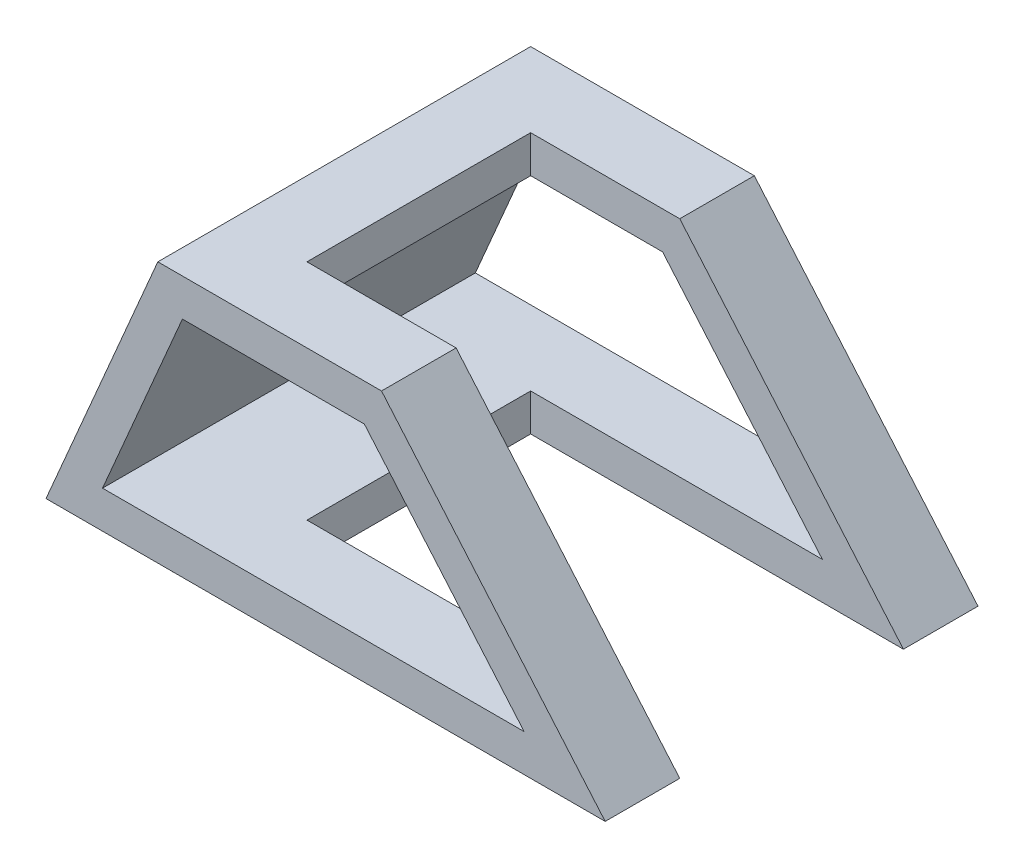
ISO-10303-21;
HEADER;
FILE_DESCRIPTION(('STEP AP214'),'2;1');
FILE_NAME('part.step','',(''),(''),'','','');
FILE_SCHEMA(('AUTOMOTIVE_DESIGN { 1 0 10303 214 1 1 1 1 }'));
ENDSEC;
DATA;
#1=APPLICATION_CONTEXT('core data for automotive mechanical design processes');
#2=APPLICATION_PROTOCOL_DEFINITION('international standard','automotive_design',2000,#1);
#3=PRODUCT_CONTEXT('',#1,'mechanical');
#4=PRODUCT('Part','Part','',(#3));
#5=PRODUCT_RELATED_PRODUCT_CATEGORY('part','',(#4));
#6=PRODUCT_DEFINITION_FORMATION('','',#4);
#7=PRODUCT_DEFINITION_CONTEXT('part definition',#1,'design');
#8=PRODUCT_DEFINITION('design','',#6,#7);
#9=PRODUCT_DEFINITION_SHAPE('','',#8);
#10=(LENGTH_UNIT() NAMED_UNIT(*) SI_UNIT(.MILLI.,.METRE.));
#11=(NAMED_UNIT(*) PLANE_ANGLE_UNIT() SI_UNIT($,.RADIAN.));
#12=(NAMED_UNIT(*) SI_UNIT($,.STERADIAN.) SOLID_ANGLE_UNIT());
#13=UNCERTAINTY_MEASURE_WITH_UNIT(LENGTH_MEASURE(1.E-05),#10,'distance_accuracy_value','');
#14=(GEOMETRIC_REPRESENTATION_CONTEXT(3) GLOBAL_UNCERTAINTY_ASSIGNED_CONTEXT((#13)) GLOBAL_UNIT_ASSIGNED_CONTEXT((#10,
#11,#12)) REPRESENTATION_CONTEXT('',''));
#15=CARTESIAN_POINT('',(0.,0.,0.));
#16=DIRECTION('',(0.,0.,1.));
#17=DIRECTION('',(1.,0.,0.));
#18=AXIS2_PLACEMENT_3D('',#15,#16,#17);
#19=CARTESIAN_POINT('',(150.,0.,-100.));
#20=DIRECTION('',(0.759256602365297,0.650791373455968,0.));
#21=DIRECTION('',(-0.650791373455968,0.759256602365297,0.));
#22=AXIS2_PLACEMENT_3D('',#19,#20,#21);
#23=PLANE('',#22);
#24=DIRECTION('',(0.,0.,1.));
#25=VECTOR('',#24,1.);
#26=CARTESIAN_POINT('',(90.,70.,-100.));
#27=LINE('',#26,#25);
#28=CARTESIAN_POINT('',(90.,70.,-100.));
#29=VERTEX_POINT('',#28);
#30=CARTESIAN_POINT('',(90.,70.,-80.));
#31=VERTEX_POINT('',#30);
#32=EDGE_CURVE('E273',#29,#31,#27,.T.);
#33=ORIENTED_EDGE('',*,*,#32,.T.);
#34=DIRECTION('',(-0.650791373455968,0.759256602365297,0.));
#35=VECTOR('',#34,1.);
#36=CARTESIAN_POINT('',(150.,0.,-80.));
#37=LINE('',#36,#35);
#38=CARTESIAN_POINT('',(150.,0.,-80.));
#39=VERTEX_POINT('',#38);
#40=EDGE_CURVE('E211',#39,#31,#37,.T.);
#41=ORIENTED_EDGE('',*,*,#40,.F.);
#42=DIRECTION('',(0.,0.,1.));
#43=VECTOR('',#42,1.);
#44=CARTESIAN_POINT('',(150.,0.,-100.));
#45=LINE('',#44,#43);
#46=CARTESIAN_POINT('',(150.,0.,-100.));
#47=VERTEX_POINT('',#46);
#48=EDGE_CURVE('E277',#47,#39,#45,.T.);
#49=ORIENTED_EDGE('',*,*,#48,.F.);
#50=DIRECTION('',(-0.650791373455968,0.759256602365297,0.));
#51=VECTOR('',#50,1.);
#52=CARTESIAN_POINT('',(150.,0.,-100.));
#53=LINE('',#52,#51);
#54=EDGE_CURVE('E255',#47,#29,#53,.T.);
#55=ORIENTED_EDGE('',*,*,#54,.T.);
#56=EDGE_LOOP('',(#33,#41,#49,#55));
#57=FACE_BOUND('',#56,.T.);
#58=ADVANCED_FACE('F45',(#57),#23,.T.);
#59=CARTESIAN_POINT('',(128.257793632439,10.,-100.));
#60=DIRECTION('',(0.759256602365296,0.650791373455969,0.));
#61=DIRECTION('',(-0.650791373455969,0.759256602365296,0.));
#62=AXIS2_PLACEMENT_3D('',#59,#60,#61);
#63=PLANE('',#62);
#64=DIRECTION('',(0.,0.,1.));
#65=VECTOR('',#64,1.);
#66=CARTESIAN_POINT('',(128.257793632439,10.,-100.));
#67=LINE('',#66,#65);
#68=CARTESIAN_POINT('',(128.257793632439,10.,-100.));
#69=VERTEX_POINT('',#68);
#70=CARTESIAN_POINT('',(128.257793632439,10.,-80.));
#71=VERTEX_POINT('',#70);
#72=EDGE_CURVE('E240',#69,#71,#67,.T.);
#73=ORIENTED_EDGE('',*,*,#72,.T.);
#74=DIRECTION('',(-0.650791373455969,0.759256602365297,0.));
#75=VECTOR('',#74,1.);
#76=CARTESIAN_POINT('',(133.836005404918,3.49208626544032,-80.));
#77=LINE('',#76,#75);
#78=CARTESIAN_POINT('',(85.4006507752959,60.,-80.));
#79=VERTEX_POINT('',#78);
#80=EDGE_CURVE('E190',#71,#79,#77,.T.);
#81=ORIENTED_EDGE('',*,*,#80,.T.);
#82=DIRECTION('',(0.,0.,1.));
#83=VECTOR('',#82,1.);
#84=CARTESIAN_POINT('',(85.4006507752958,60.,-100.));
#85=LINE('',#84,#83);
#86=CARTESIAN_POINT('',(85.4006507752958,60.,-100.));
#87=VERTEX_POINT('',#86);
#88=EDGE_CURVE('E181',#87,#79,#85,.T.);
#89=ORIENTED_EDGE('',*,*,#88,.F.);
#90=DIRECTION('',(-0.650791373455969,0.759256602365296,0.));
#91=VECTOR('',#90,1.);
#92=CARTESIAN_POINT('',(128.257793632439,10.,-100.));
#93=LINE('',#92,#91);
#94=EDGE_CURVE('E224',#69,#87,#93,.T.);
#95=ORIENTED_EDGE('',*,*,#94,.F.);
#96=EDGE_LOOP('',(#73,#81,#89,#95));
#97=FACE_BOUND('',#96,.T.);
#98=ADVANCED_FACE('F320',(#97),#63,.F.);
#99=CARTESIAN_POINT('',(30.,70.,-100.));
#100=DIRECTION('',(-0.919145030018058,0.393919298579168,0.));
#101=DIRECTION('',(-0.393919298579168,-0.919145030018058,0.));
#102=AXIS2_PLACEMENT_3D('',#99,#100,#101);
#103=PLANE('',#102);
#104=DIRECTION('',(-0.393919298579168,-0.919145030018058,0.));
#105=VECTOR('',#104,1.);
#106=CARTESIAN_POINT('',(30.,70.,0.));
#107=LINE('',#106,#105);
#108=CARTESIAN_POINT('',(30.,70.,0.));
#109=VERTEX_POINT('',#108);
#110=CARTESIAN_POINT('',(0.,0.,0.));
#111=VERTEX_POINT('',#110);
#112=EDGE_CURVE('E238',#109,#111,#107,.T.);
#113=ORIENTED_EDGE('',*,*,#112,.F.);
#114=DIRECTION('',(0.,0.,1.));
#115=VECTOR('',#114,1.);
#116=CARTESIAN_POINT('',(30.,70.,-100.));
#117=LINE('',#116,#115);
#118=CARTESIAN_POINT('',(30.,70.,-100.));
#119=VERTEX_POINT('',#118);
#120=EDGE_CURVE('E53',#119,#109,#117,.T.);
#121=ORIENTED_EDGE('',*,*,#120,.F.);
#122=DIRECTION('',(-0.393919298579168,-0.919145030018058,0.));
#123=VECTOR('',#122,1.);
#124=CARTESIAN_POINT('',(30.,70.,-100.));
#125=LINE('',#124,#123);
#126=CARTESIAN_POINT('',(0.,0.,-100.));
#127=VERTEX_POINT('',#126);
#128=EDGE_CURVE('E248',#119,#127,#125,.T.);
#129=ORIENTED_EDGE('',*,*,#128,.T.);
#130=DIRECTION('',(0.,0.,1.));
#131=VECTOR('',#130,1.);
#132=CARTESIAN_POINT('',(0.,0.,-100.));
#133=LINE('',#132,#131);
#134=EDGE_CURVE('E261',#127,#111,#133,.T.);
#135=ORIENTED_EDGE('',*,*,#134,.T.);
#136=EDGE_LOOP('',(#113,#121,#129,#135));
#137=FACE_BOUND('',#136,.T.);
#138=ADVANCED_FACE('F47',(#137),#103,.T.);
#139=CARTESIAN_POINT('',(90.,70.,-100.));
#140=DIRECTION('',(0.,1.,0.));
#141=DIRECTION('',(-1.,0.,0.));
#142=AXIS2_PLACEMENT_3D('',#139,#140,#141);
#143=PLANE('',#142);
#144=DIRECTION('',(1.,0.,0.));
#145=VECTOR('',#144,1.);
#146=CARTESIAN_POINT('',(90.,70.,-20.));
#147=LINE('',#146,#145);
#148=CARTESIAN_POINT('',(50.,70.,-20.));
#149=VERTEX_POINT('',#148);
#150=CARTESIAN_POINT('',(90.,70.,-20.));
#151=VERTEX_POINT('',#150);
#152=EDGE_CURVE('E182',#149,#151,#147,.T.);
#153=ORIENTED_EDGE('',*,*,#152,.F.);
#154=DIRECTION('',(0.,0.,1.));
#155=VECTOR('',#154,1.);
#156=CARTESIAN_POINT('',(50.,70.,-80.));
#157=LINE('',#156,#155);
#158=CARTESIAN_POINT('',(50.,70.,-80.));
#159=VERTEX_POINT('',#158);
#160=EDGE_CURVE('E184',#159,#149,#157,.T.);
#161=ORIENTED_EDGE('',*,*,#160,.F.);
#162=DIRECTION('',(-1.,0.,0.));
#163=VECTOR('',#162,1.);
#164=CARTESIAN_POINT('',(90.,70.,-80.));
#165=LINE('',#164,#163);
#166=EDGE_CURVE('E165',#31,#159,#165,.T.);
#167=ORIENTED_EDGE('',*,*,#166,.F.);
#168=ORIENTED_EDGE('',*,*,#32,.F.);
#169=DIRECTION('',(-1.,0.,0.));
#170=VECTOR('',#169,1.);
#171=CARTESIAN_POINT('',(90.,70.,-100.));
#172=LINE('',#171,#170);
#173=EDGE_CURVE('E258',#29,#119,#172,.T.);
#174=ORIENTED_EDGE('',*,*,#173,.T.);
#175=ORIENTED_EDGE('',*,*,#120,.T.);
#176=DIRECTION('',(-1.,0.,0.));
#177=VECTOR('',#176,1.);
#178=CARTESIAN_POINT('',(90.,70.,0.));
#179=LINE('',#178,#177);
#180=CARTESIAN_POINT('',(90.,70.,0.));
#181=VERTEX_POINT('',#180);
#182=EDGE_CURVE('E252',#181,#109,#179,.T.);
#183=ORIENTED_EDGE('',*,*,#182,.F.);
#184=EDGE_CURVE('E276',#151,#181,#27,.T.);
#185=ORIENTED_EDGE('',*,*,#184,.F.);
#186=EDGE_LOOP('',(#153,#161,#167,#168,#174,#175,#183,#185));
#187=FACE_BOUND('',#186,.T.);
#188=ADVANCED_FACE('F303',(#187),#143,.T.);
#189=DIRECTION('',(0.650791373455968,-0.759256602365297,0.));
#190=VECTOR('',#189,1.);
#191=CARTESIAN_POINT('',(150.,0.,-20.));
#192=LINE('',#191,#190);
#193=CARTESIAN_POINT('',(150.,0.,-20.));
#194=VERTEX_POINT('',#193);
#195=EDGE_CURVE('E60',#151,#194,#192,.T.);
#196=ORIENTED_EDGE('',*,*,#195,.F.);
#197=ORIENTED_EDGE('',*,*,#184,.T.);
#198=DIRECTION('',(-0.650791373455968,0.759256602365297,0.));
#199=VECTOR('',#198,1.);
#200=CARTESIAN_POINT('',(150.,0.,0.));
#201=LINE('',#200,#199);
#202=CARTESIAN_POINT('',(150.,0.,0.));
#203=VERTEX_POINT('',#202);
#204=EDGE_CURVE('E267',#203,#181,#201,.T.);
#205=ORIENTED_EDGE('',*,*,#204,.F.);
#206=EDGE_CURVE('E279',#194,#203,#45,.T.);
#207=ORIENTED_EDGE('',*,*,#206,.F.);
#208=EDGE_LOOP('',(#196,#197,#205,#207));
#209=FACE_BOUND('',#208,.T.);
#210=ADVANCED_FACE('F290',(#209),#23,.T.);
#211=CARTESIAN_POINT('',(0.,0.,-100.));
#212=DIRECTION('',(0.,-1.,0.));
#213=DIRECTION('',(0.,0.,-1.));
#214=AXIS2_PLACEMENT_3D('',#211,#212,#213);
#215=PLANE('',#214);
#216=DIRECTION('',(1.,0.,0.));
#217=VECTOR('',#216,1.);
#218=CARTESIAN_POINT('',(150.,0.,-80.));
#219=LINE('',#218,#217);
#220=CARTESIAN_POINT('',(50.,0.,-80.));
#221=VERTEX_POINT('',#220);
#222=EDGE_CURVE('E198',#221,#39,#219,.T.);
#223=ORIENTED_EDGE('',*,*,#222,.F.);
#224=DIRECTION('',(0.,0.,-1.));
#225=VECTOR('',#224,1.);
#226=CARTESIAN_POINT('',(50.,0.,-20.));
#227=LINE('',#226,#225);
#228=CARTESIAN_POINT('',(50.,0.,-20.));
#229=VERTEX_POINT('',#228);
#230=EDGE_CURVE('E203',#229,#221,#227,.T.);
#231=ORIENTED_EDGE('',*,*,#230,.F.);
#232=DIRECTION('',(-1.,0.,0.));
#233=VECTOR('',#232,1.);
#234=CARTESIAN_POINT('',(150.,0.,-20.));
#235=LINE('',#234,#233);
#236=EDGE_CURVE('E195',#194,#229,#235,.T.);
#237=ORIENTED_EDGE('',*,*,#236,.F.);
#238=ORIENTED_EDGE('',*,*,#206,.T.);
#239=DIRECTION('',(1.,0.,0.));
#240=VECTOR('',#239,1.);
#241=CARTESIAN_POINT('',(0.,0.,0.));
#242=LINE('',#241,#240);
#243=EDGE_CURVE('E264',#111,#203,#242,.T.);
#244=ORIENTED_EDGE('',*,*,#243,.F.);
#245=ORIENTED_EDGE('',*,*,#134,.F.);
#246=DIRECTION('',(1.,0.,0.));
#247=VECTOR('',#246,1.);
#248=CARTESIAN_POINT('',(0.,0.,-100.));
#249=LINE('',#248,#247);
#250=EDGE_CURVE('E251',#127,#47,#249,.T.);
#251=ORIENTED_EDGE('',*,*,#250,.T.);
#252=ORIENTED_EDGE('',*,*,#48,.T.);
#253=EDGE_LOOP('',(#223,#231,#237,#238,#244,#245,#251,#252));
#254=FACE_BOUND('',#253,.T.);
#255=ADVANCED_FACE('F287',(#254),#215,.T.);
#256=CARTESIAN_POINT('',(0.,0.,-100.));
#257=DIRECTION('',(0.,0.,1.));
#258=DIRECTION('',(1.,0.,0.));
#259=AXIS2_PLACEMENT_3D('',#256,#257,#258);
#260=PLANE('',#259);
#261=ORIENTED_EDGE('',*,*,#94,.T.);
#262=DIRECTION('',(-1.,0.,0.));
#263=VECTOR('',#262,1.);
#264=CARTESIAN_POINT('',(85.4006507752958,60.,-100.));
#265=LINE('',#264,#263);
#266=CARTESIAN_POINT('',(36.5939615798056,60.,-100.));
#267=VERTEX_POINT('',#266);
#268=EDGE_CURVE('E214',#87,#267,#265,.T.);
#269=ORIENTED_EDGE('',*,*,#268,.T.);
#270=DIRECTION('',(-0.393919298579167,-0.919145030018058,0.));
#271=VECTOR('',#270,1.);
#272=CARTESIAN_POINT('',(36.5939615798056,60.,-100.));
#273=LINE('',#272,#271);
#274=CARTESIAN_POINT('',(15.1653901512341,10.,-100.));
#275=VERTEX_POINT('',#274);
#276=EDGE_CURVE('E217',#267,#275,#273,.T.);
#277=ORIENTED_EDGE('',*,*,#276,.T.);
#278=DIRECTION('',(1.,0.,0.));
#279=VECTOR('',#278,1.);
#280=CARTESIAN_POINT('',(15.1653901512341,10.,-100.));
#281=LINE('',#280,#279);
#282=EDGE_CURVE('E221',#275,#69,#281,.T.);
#283=ORIENTED_EDGE('',*,*,#282,.T.);
#284=EDGE_LOOP('',(#261,#269,#277,#283));
#285=FACE_BOUND('',#284,.T.);
#286=ORIENTED_EDGE('',*,*,#128,.F.);
#287=ORIENTED_EDGE('',*,*,#173,.F.);
#288=ORIENTED_EDGE('',*,*,#54,.F.);
#289=ORIENTED_EDGE('',*,*,#250,.F.);
#290=EDGE_LOOP('',(#286,#287,#288,#289));
#291=FACE_BOUND('',#290,.T.);
#292=ADVANCED_FACE('F300',(#285,#291),#260,.F.);
#293=CARTESIAN_POINT('',(0.,0.,0.));
#294=DIRECTION('',(0.,0.,1.));
#295=DIRECTION('',(1.,0.,0.));
#296=AXIS2_PLACEMENT_3D('',#293,#294,#295);
#297=PLANE('',#296);
#298=DIRECTION('',(-1.,0.,0.));
#299=VECTOR('',#298,1.);
#300=CARTESIAN_POINT('',(85.4006507752958,60.,0.));
#301=LINE('',#300,#299);
#302=CARTESIAN_POINT('',(85.4006507752958,60.,0.));
#303=VERTEX_POINT('',#302);
#304=CARTESIAN_POINT('',(36.5939615798056,60.,0.));
#305=VERTEX_POINT('',#304);
#306=EDGE_CURVE('E213',#303,#305,#301,.T.);
#307=ORIENTED_EDGE('',*,*,#306,.F.);
#308=DIRECTION('',(-0.650791373455969,0.759256602365296,0.));
#309=VECTOR('',#308,1.);
#310=CARTESIAN_POINT('',(128.257793632439,10.,0.));
#311=LINE('',#310,#309);
#312=CARTESIAN_POINT('',(128.257793632439,10.,0.));
#313=VERTEX_POINT('',#312);
#314=EDGE_CURVE('E218',#313,#303,#311,.T.);
#315=ORIENTED_EDGE('',*,*,#314,.F.);
#316=DIRECTION('',(1.,0.,0.));
#317=VECTOR('',#316,1.);
#318=CARTESIAN_POINT('',(15.1653901512341,10.,0.));
#319=LINE('',#318,#317);
#320=CARTESIAN_POINT('',(15.1653901512341,10.,0.));
#321=VERTEX_POINT('',#320);
#322=EDGE_CURVE('E232',#321,#313,#319,.T.);
#323=ORIENTED_EDGE('',*,*,#322,.F.);
#324=DIRECTION('',(-0.393919298579167,-0.919145030018058,0.));
#325=VECTOR('',#324,1.);
#326=CARTESIAN_POINT('',(36.5939615798056,60.,0.));
#327=LINE('',#326,#325);
#328=EDGE_CURVE('E229',#305,#321,#327,.T.);
#329=ORIENTED_EDGE('',*,*,#328,.F.);
#330=EDGE_LOOP('',(#307,#315,#323,#329));
#331=FACE_BOUND('',#330,.T.);
#332=ORIENTED_EDGE('',*,*,#112,.T.);
#333=ORIENTED_EDGE('',*,*,#243,.T.);
#334=ORIENTED_EDGE('',*,*,#204,.T.);
#335=ORIENTED_EDGE('',*,*,#182,.T.);
#336=EDGE_LOOP('',(#332,#333,#334,#335));
#337=FACE_BOUND('',#336,.T.);
#338=ADVANCED_FACE('F294',(#331,#337),#297,.T.);
#339=CARTESIAN_POINT('',(85.4006507752958,60.,-100.));
#340=DIRECTION('',(0.,1.,0.));
#341=DIRECTION('',(0.,0.,1.));
#342=AXIS2_PLACEMENT_3D('',#339,#340,#341);
#343=PLANE('',#342);
#344=DIRECTION('',(0.,0.,1.));
#345=VECTOR('',#344,1.);
#346=CARTESIAN_POINT('',(50.,60.,-80.));
#347=LINE('',#346,#345);
#348=CARTESIAN_POINT('',(50.,60.,-80.));
#349=VERTEX_POINT('',#348);
#350=CARTESIAN_POINT('',(50.,60.,-20.));
#351=VERTEX_POINT('',#350);
#352=EDGE_CURVE('E173',#349,#351,#347,.T.);
#353=ORIENTED_EDGE('',*,*,#352,.T.);
#354=DIRECTION('',(1.,0.,0.));
#355=VECTOR('',#354,1.);
#356=CARTESIAN_POINT('',(90.,60.,-20.));
#357=LINE('',#356,#355);
#358=CARTESIAN_POINT('',(85.4006507752959,60.,-20.));
#359=VERTEX_POINT('',#358);
#360=EDGE_CURVE('E170',#351,#359,#357,.T.);
#361=ORIENTED_EDGE('',*,*,#360,.T.);
#362=EDGE_CURVE('E239',#359,#303,#85,.T.);
#363=ORIENTED_EDGE('',*,*,#362,.T.);
#364=ORIENTED_EDGE('',*,*,#306,.T.);
#365=DIRECTION('',(0.,0.,1.));
#366=VECTOR('',#365,1.);
#367=CARTESIAN_POINT('',(36.5939615798056,60.,-100.));
#368=LINE('',#367,#366);
#369=EDGE_CURVE('E227',#267,#305,#368,.T.);
#370=ORIENTED_EDGE('',*,*,#369,.F.);
#371=ORIENTED_EDGE('',*,*,#268,.F.);
#372=ORIENTED_EDGE('',*,*,#88,.T.);
#373=DIRECTION('',(-1.,0.,0.));
#374=VECTOR('',#373,1.);
#375=CARTESIAN_POINT('',(90.,60.,-80.));
#376=LINE('',#375,#374);
#377=EDGE_CURVE('E163',#79,#349,#376,.T.);
#378=ORIENTED_EDGE('',*,*,#377,.T.);
#379=EDGE_LOOP('',(#353,#361,#363,#364,#370,#371,#372,#378));
#380=FACE_BOUND('',#379,.T.);
#381=ADVANCED_FACE('F179',(#380),#343,.F.);
#382=ORIENTED_EDGE('',*,*,#362,.F.);
#383=DIRECTION('',(0.650791373455969,-0.759256602365297,0.));
#384=VECTOR('',#383,1.);
#385=CARTESIAN_POINT('',(133.836005404919,3.4920862654403,-20.));
#386=LINE('',#385,#384);
#387=CARTESIAN_POINT('',(128.257793632439,10.,-20.));
#388=VERTEX_POINT('',#387);
#389=EDGE_CURVE('E193',#359,#388,#386,.T.);
#390=ORIENTED_EDGE('',*,*,#389,.T.);
#391=EDGE_CURVE('E243',#388,#313,#67,.T.);
#392=ORIENTED_EDGE('',*,*,#391,.T.);
#393=ORIENTED_EDGE('',*,*,#314,.T.);
#394=EDGE_LOOP('',(#382,#390,#392,#393));
#395=FACE_BOUND('',#394,.T.);
#396=ADVANCED_FACE('F327',(#395),#63,.F.);
#397=CARTESIAN_POINT('',(15.1653901512341,10.,-100.));
#398=DIRECTION('',(0.,-1.,0.));
#399=DIRECTION('',(1.,0.,0.));
#400=AXIS2_PLACEMENT_3D('',#397,#398,#399);
#401=PLANE('',#400);
#402=DIRECTION('',(0.,0.,-1.));
#403=VECTOR('',#402,1.);
#404=CARTESIAN_POINT('',(50.,10.,-20.));
#405=LINE('',#404,#403);
#406=CARTESIAN_POINT('',(50.,10.,-20.));
#407=VERTEX_POINT('',#406);
#408=CARTESIAN_POINT('',(50.,10.,-80.));
#409=VERTEX_POINT('',#408);
#410=EDGE_CURVE('E68',#407,#409,#405,.T.);
#411=ORIENTED_EDGE('',*,*,#410,.T.);
#412=DIRECTION('',(1.,0.,0.));
#413=VECTOR('',#412,1.);
#414=CARTESIAN_POINT('',(150.,10.,-80.));
#415=LINE('',#414,#413);
#416=EDGE_CURVE('E197',#409,#71,#415,.T.);
#417=ORIENTED_EDGE('',*,*,#416,.T.);
#418=ORIENTED_EDGE('',*,*,#72,.F.);
#419=ORIENTED_EDGE('',*,*,#282,.F.);
#420=DIRECTION('',(0.,0.,1.));
#421=VECTOR('',#420,1.);
#422=CARTESIAN_POINT('',(15.1653901512341,10.,-100.));
#423=LINE('',#422,#421);
#424=EDGE_CURVE('E244',#275,#321,#423,.T.);
#425=ORIENTED_EDGE('',*,*,#424,.T.);
#426=ORIENTED_EDGE('',*,*,#322,.T.);
#427=ORIENTED_EDGE('',*,*,#391,.F.);
#428=DIRECTION('',(-1.,0.,0.));
#429=VECTOR('',#428,1.);
#430=CARTESIAN_POINT('',(15.1653901512341,10.,-20.));
#431=LINE('',#430,#429);
#432=EDGE_CURVE('E11',#388,#407,#431,.T.);
#433=ORIENTED_EDGE('',*,*,#432,.T.);
#434=EDGE_LOOP('',(#411,#417,#418,#419,#425,#426,#427,#433));
#435=FACE_BOUND('',#434,.T.);
#436=ADVANCED_FACE('F348',(#435),#401,.F.);
#437=CARTESIAN_POINT('',(36.5939615798056,60.,-100.));
#438=DIRECTION('',(-0.919145030018058,0.393919298579168,0.));
#439=DIRECTION('',(-0.393919298579168,-0.919145030018058,0.));
#440=AXIS2_PLACEMENT_3D('',#437,#438,#439);
#441=PLANE('',#440);
#442=ORIENTED_EDGE('',*,*,#328,.T.);
#443=ORIENTED_EDGE('',*,*,#424,.F.);
#444=ORIENTED_EDGE('',*,*,#276,.F.);
#445=ORIENTED_EDGE('',*,*,#369,.T.);
#446=EDGE_LOOP('',(#442,#443,#444,#445));
#447=FACE_BOUND('',#446,.T.);
#448=ADVANCED_FACE('F345',(#447),#441,.F.);
#449=CARTESIAN_POINT('',(150.,10.,-80.));
#450=DIRECTION('',(0.,0.,-1.));
#451=DIRECTION('',(-1.,0.,0.));
#452=AXIS2_PLACEMENT_3D('',#449,#450,#451);
#453=PLANE('',#452);
#454=ORIENTED_EDGE('',*,*,#40,.T.);
#455=ORIENTED_EDGE('',*,*,#166,.T.);
#456=DIRECTION('',(0.,1.,0.));
#457=VECTOR('',#456,1.);
#458=CARTESIAN_POINT('',(50.,60.,-80.));
#459=LINE('',#458,#457);
#460=EDGE_CURVE('E158',#349,#159,#459,.T.);
#461=ORIENTED_EDGE('',*,*,#460,.F.);
#462=ORIENTED_EDGE('',*,*,#377,.F.);
#463=ORIENTED_EDGE('',*,*,#80,.F.);
#464=ORIENTED_EDGE('',*,*,#416,.F.);
#465=DIRECTION('',(0.,-1.,0.));
#466=VECTOR('',#465,1.);
#467=CARTESIAN_POINT('',(50.,10.,-80.));
#468=LINE('',#467,#466);
#469=EDGE_CURVE('E207',#409,#221,#468,.T.);
#470=ORIENTED_EDGE('',*,*,#469,.T.);
#471=ORIENTED_EDGE('',*,*,#222,.T.);
#472=EDGE_LOOP('',(#454,#455,#461,#462,#463,#464,#470,#471));
#473=FACE_BOUND('',#472,.T.);
#474=ADVANCED_FACE('F161',(#473),#453,.F.);
#475=CARTESIAN_POINT('',(50.,10.,-20.));
#476=DIRECTION('',(-1.,0.,0.));
#477=DIRECTION('',(0.,0.,1.));
#478=AXIS2_PLACEMENT_3D('',#475,#476,#477);
#479=PLANE('',#478);
#480=ORIENTED_EDGE('',*,*,#230,.T.);
#481=ORIENTED_EDGE('',*,*,#469,.F.);
#482=ORIENTED_EDGE('',*,*,#410,.F.);
#483=DIRECTION('',(0.,-1.,0.));
#484=VECTOR('',#483,1.);
#485=CARTESIAN_POINT('',(50.,10.,-20.));
#486=LINE('',#485,#484);
#487=EDGE_CURVE('E201',#407,#229,#486,.T.);
#488=ORIENTED_EDGE('',*,*,#487,.T.);
#489=EDGE_LOOP('',(#480,#481,#482,#488));
#490=FACE_BOUND('',#489,.T.);
#491=ADVANCED_FACE('F307',(#490),#479,.F.);
#492=CARTESIAN_POINT('',(150.,10.,-20.));
#493=DIRECTION('',(0.,0.,1.));
#494=DIRECTION('',(1.,0.,0.));
#495=AXIS2_PLACEMENT_3D('',#492,#493,#494);
#496=PLANE('',#495);
#497=ORIENTED_EDGE('',*,*,#152,.T.);
#498=ORIENTED_EDGE('',*,*,#195,.T.);
#499=ORIENTED_EDGE('',*,*,#236,.T.);
#500=ORIENTED_EDGE('',*,*,#487,.F.);
#501=ORIENTED_EDGE('',*,*,#432,.F.);
#502=ORIENTED_EDGE('',*,*,#389,.F.);
#503=ORIENTED_EDGE('',*,*,#360,.F.);
#504=DIRECTION('',(0.,1.,0.));
#505=VECTOR('',#504,1.);
#506=CARTESIAN_POINT('',(50.,60.,-20.));
#507=LINE('',#506,#505);
#508=EDGE_CURVE('E169',#351,#149,#507,.T.);
#509=ORIENTED_EDGE('',*,*,#508,.T.);
#510=EDGE_LOOP('',(#497,#498,#499,#500,#501,#502,#503,#509));
#511=FACE_BOUND('',#510,.T.);
#512=ADVANCED_FACE('F309',(#511),#496,.F.);
#513=CARTESIAN_POINT('',(50.,60.,-80.));
#514=DIRECTION('',(-1.,0.,0.));
#515=DIRECTION('',(0.,-1.,0.));
#516=AXIS2_PLACEMENT_3D('',#513,#514,#515);
#517=PLANE('',#516);
#518=ORIENTED_EDGE('',*,*,#160,.T.);
#519=ORIENTED_EDGE('',*,*,#508,.F.);
#520=ORIENTED_EDGE('',*,*,#352,.F.);
#521=ORIENTED_EDGE('',*,*,#460,.T.);
#522=EDGE_LOOP('',(#518,#519,#520,#521));
#523=FACE_BOUND('',#522,.T.);
#524=ADVANCED_FACE('F174',(#523),#517,.F.);
#525=CLOSED_SHELL('',(#58,#98,#138,#188,#210,#255,#292,#338,#381,#396,#436,#448,#474,#491,#512,#524));
#526=MANIFOLD_SOLID_BREP('B2',#525);
#527=ADVANCED_BREP_SHAPE_REPRESENTATION('',(#18,#526),#14);
#528=SHAPE_DEFINITION_REPRESENTATION(#9,#527);
ENDSEC;
END-ISO-10303-21;
